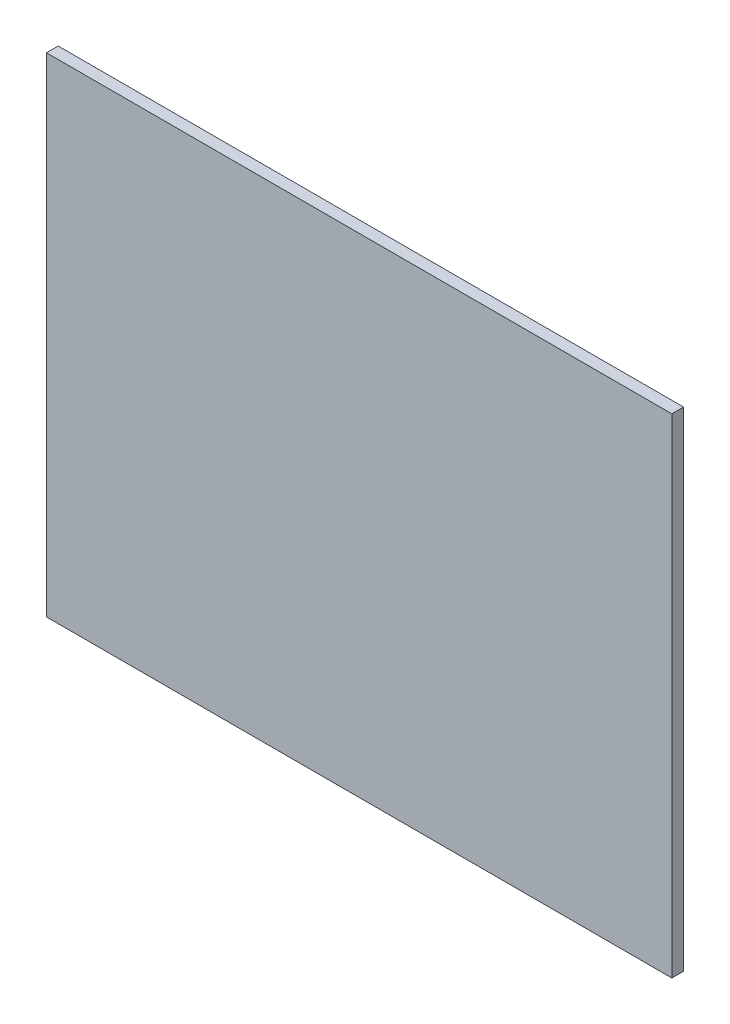
ISO-10303-21;
HEADER;
FILE_DESCRIPTION(('STEP AP214'),'2;1');
FILE_NAME('part.step','',(''),(''),'','','');
FILE_SCHEMA(('AUTOMOTIVE_DESIGN { 1 0 10303 214 1 1 1 1 }'));
ENDSEC;
DATA;
#1=APPLICATION_CONTEXT('core data for automotive mechanical design processes');
#2=APPLICATION_PROTOCOL_DEFINITION('international standard','automotive_design',2000,#1);
#3=PRODUCT_CONTEXT('',#1,'mechanical');
#4=PRODUCT('Part','Part','',(#3));
#5=PRODUCT_RELATED_PRODUCT_CATEGORY('part','',(#4));
#6=PRODUCT_DEFINITION_FORMATION('','',#4);
#7=PRODUCT_DEFINITION_CONTEXT('part definition',#1,'design');
#8=PRODUCT_DEFINITION('design','',#6,#7);
#9=PRODUCT_DEFINITION_SHAPE('','',#8);
#10=(LENGTH_UNIT() NAMED_UNIT(*) SI_UNIT(.MILLI.,.METRE.));
#11=(NAMED_UNIT(*) PLANE_ANGLE_UNIT() SI_UNIT($,.RADIAN.));
#12=(NAMED_UNIT(*) SI_UNIT($,.STERADIAN.) SOLID_ANGLE_UNIT());
#13=UNCERTAINTY_MEASURE_WITH_UNIT(LENGTH_MEASURE(1.E-05),#10,'distance_accuracy_value','');
#14=(GEOMETRIC_REPRESENTATION_CONTEXT(3) GLOBAL_UNCERTAINTY_ASSIGNED_CONTEXT((#13)) GLOBAL_UNIT_ASSIGNED_CONTEXT((#10,
#11,#12)) REPRESENTATION_CONTEXT('',''));
#15=CARTESIAN_POINT('',(0.,0.,0.));
#16=DIRECTION('',(0.,0.,1.));
#17=DIRECTION('',(1.,0.,0.));
#18=AXIS2_PLACEMENT_3D('',#15,#16,#17);
#19=CARTESIAN_POINT('',(0.,0.,0.));
#20=DIRECTION('',(0.,0.,1.));
#21=DIRECTION('',(1.,0.,0.));
#22=AXIS2_PLACEMENT_3D('',#19,#20,#21);
#23=PLANE('',#22);
#24=DIRECTION('',(1.,0.,0.));
#25=VECTOR('',#24,1.);
#26=CARTESIAN_POINT('',(-80.,-62.5,0.));
#27=LINE('',#26,#25);
#28=CARTESIAN_POINT('',(-80.,-62.5,0.));
#29=VERTEX_POINT('',#28);
#30=CARTESIAN_POINT('',(80.,-62.5,0.));
#31=VERTEX_POINT('',#30);
#32=EDGE_CURVE('E27',#29,#31,#27,.T.);
#33=ORIENTED_EDGE('',*,*,#32,.F.);
#34=DIRECTION('',(0.,-1.,0.));
#35=VECTOR('',#34,1.);
#36=CARTESIAN_POINT('',(-80.,62.5,0.));
#37=LINE('',#36,#35);
#38=CARTESIAN_POINT('',(-80.,62.5,0.));
#39=VERTEX_POINT('',#38);
#40=EDGE_CURVE('E90',#39,#29,#37,.T.);
#41=ORIENTED_EDGE('',*,*,#40,.F.);
#42=DIRECTION('',(-1.,0.,0.));
#43=VECTOR('',#42,1.);
#44=CARTESIAN_POINT('',(80.,62.5,0.));
#45=LINE('',#44,#43);
#46=CARTESIAN_POINT('',(80.,62.5,0.));
#47=VERTEX_POINT('',#46);
#48=EDGE_CURVE('E75',#47,#39,#45,.T.);
#49=ORIENTED_EDGE('',*,*,#48,.F.);
#50=DIRECTION('',(0.,1.,0.));
#51=VECTOR('',#50,1.);
#52=CARTESIAN_POINT('',(80.,-62.5,0.));
#53=LINE('',#52,#51);
#54=EDGE_CURVE('E108',#31,#47,#53,.T.);
#55=ORIENTED_EDGE('',*,*,#54,.F.);
#56=EDGE_LOOP('',(#33,#41,#49,#55));
#57=FACE_BOUND('',#56,.T.);
#58=ADVANCED_FACE('F17',(#57),#23,.F.);
#59=CARTESIAN_POINT('',(0.,0.,3.));
#60=DIRECTION('',(0.,0.,1.));
#61=DIRECTION('',(1.,0.,0.));
#62=AXIS2_PLACEMENT_3D('',#59,#60,#61);
#63=PLANE('',#62);
#64=DIRECTION('',(1.,0.,0.));
#65=VECTOR('',#64,1.);
#66=CARTESIAN_POINT('',(-80.,-62.5,3.));
#67=LINE('',#66,#65);
#68=CARTESIAN_POINT('',(-80.,-62.5,3.));
#69=VERTEX_POINT('',#68);
#70=CARTESIAN_POINT('',(80.,-62.5,3.));
#71=VERTEX_POINT('',#70);
#72=EDGE_CURVE('E11',#69,#71,#67,.T.);
#73=ORIENTED_EDGE('',*,*,#72,.T.);
#74=DIRECTION('',(0.,1.,0.));
#75=VECTOR('',#74,1.);
#76=CARTESIAN_POINT('',(80.,-62.5,3.));
#77=LINE('',#76,#75);
#78=CARTESIAN_POINT('',(80.,62.5,3.));
#79=VERTEX_POINT('',#78);
#80=EDGE_CURVE('E106',#71,#79,#77,.T.);
#81=ORIENTED_EDGE('',*,*,#80,.T.);
#82=DIRECTION('',(-1.,0.,0.));
#83=VECTOR('',#82,1.);
#84=CARTESIAN_POINT('',(80.,62.5,3.));
#85=LINE('',#84,#83);
#86=CARTESIAN_POINT('',(-80.,62.5,3.));
#87=VERTEX_POINT('',#86);
#88=EDGE_CURVE('E83',#79,#87,#85,.T.);
#89=ORIENTED_EDGE('',*,*,#88,.T.);
#90=DIRECTION('',(0.,-1.,0.));
#91=VECTOR('',#90,1.);
#92=CARTESIAN_POINT('',(-80.,62.5,3.));
#93=LINE('',#92,#91);
#94=EDGE_CURVE('E89',#87,#69,#93,.T.);
#95=ORIENTED_EDGE('',*,*,#94,.T.);
#96=EDGE_LOOP('',(#73,#81,#89,#95));
#97=FACE_BOUND('',#96,.T.);
#98=ADVANCED_FACE('F159',(#97),#63,.T.);
#99=CARTESIAN_POINT('',(-80.,-62.5,0.));
#100=DIRECTION('',(0.,-1.,0.));
#101=DIRECTION('',(0.,0.,-1.));
#102=AXIS2_PLACEMENT_3D('',#99,#100,#101);
#103=PLANE('',#102);
#104=ORIENTED_EDGE('',*,*,#32,.T.);
#105=DIRECTION('',(0.,0.,1.));
#106=VECTOR('',#105,1.);
#107=CARTESIAN_POINT('',(80.,-62.5,0.));
#108=LINE('',#107,#106);
#109=EDGE_CURVE('E102',#31,#71,#108,.T.);
#110=ORIENTED_EDGE('',*,*,#109,.T.);
#111=ORIENTED_EDGE('',*,*,#72,.F.);
#112=DIRECTION('',(0.,0.,1.));
#113=VECTOR('',#112,1.);
#114=CARTESIAN_POINT('',(-80.,-62.5,0.));
#115=LINE('',#114,#113);
#116=EDGE_CURVE('E94',#29,#69,#115,.T.);
#117=ORIENTED_EDGE('',*,*,#116,.F.);
#118=EDGE_LOOP('',(#104,#110,#111,#117));
#119=FACE_BOUND('',#118,.T.);
#120=ADVANCED_FACE('F19',(#119),#103,.T.);
#121=CARTESIAN_POINT('',(80.,-62.5,0.));
#122=DIRECTION('',(1.,0.,0.));
#123=DIRECTION('',(0.,1.,0.));
#124=AXIS2_PLACEMENT_3D('',#121,#122,#123);
#125=PLANE('',#124);
#126=ORIENTED_EDGE('',*,*,#54,.T.);
#127=DIRECTION('',(0.,0.,1.));
#128=VECTOR('',#127,1.);
#129=CARTESIAN_POINT('',(80.,62.5,0.));
#130=LINE('',#129,#128);
#131=EDGE_CURVE('E77',#47,#79,#130,.T.);
#132=ORIENTED_EDGE('',*,*,#131,.T.);
#133=ORIENTED_EDGE('',*,*,#80,.F.);
#134=ORIENTED_EDGE('',*,*,#109,.F.);
#135=EDGE_LOOP('',(#126,#132,#133,#134));
#136=FACE_BOUND('',#135,.T.);
#137=ADVANCED_FACE('F157',(#136),#125,.T.);
#138=CARTESIAN_POINT('',(80.,62.5,0.));
#139=DIRECTION('',(0.,1.,0.));
#140=DIRECTION('',(1.,0.,0.));
#141=AXIS2_PLACEMENT_3D('',#138,#139,#140);
#142=PLANE('',#141);
#143=ORIENTED_EDGE('',*,*,#48,.T.);
#144=DIRECTION('',(0.,0.,1.));
#145=VECTOR('',#144,1.);
#146=CARTESIAN_POINT('',(-80.,62.5,0.));
#147=LINE('',#146,#145);
#148=EDGE_CURVE('E74',#39,#87,#147,.T.);
#149=ORIENTED_EDGE('',*,*,#148,.T.);
#150=ORIENTED_EDGE('',*,*,#88,.F.);
#151=ORIENTED_EDGE('',*,*,#131,.F.);
#152=EDGE_LOOP('',(#143,#149,#150,#151));
#153=FACE_BOUND('',#152,.T.);
#154=ADVANCED_FACE('F73',(#153),#142,.T.);
#155=CARTESIAN_POINT('',(-80.,62.5,0.));
#156=DIRECTION('',(-1.,0.,0.));
#157=DIRECTION('',(0.,0.,1.));
#158=AXIS2_PLACEMENT_3D('',#155,#156,#157);
#159=PLANE('',#158);
#160=ORIENTED_EDGE('',*,*,#40,.T.);
#161=ORIENTED_EDGE('',*,*,#116,.T.);
#162=ORIENTED_EDGE('',*,*,#94,.F.);
#163=ORIENTED_EDGE('',*,*,#148,.F.);
#164=EDGE_LOOP('',(#160,#161,#162,#163));
#165=FACE_BOUND('',#164,.T.);
#166=ADVANCED_FACE('F87',(#165),#159,.T.);
#167=CLOSED_SHELL('',(#58,#98,#120,#137,#154,#166));
#168=MANIFOLD_SOLID_BREP('B1',#167);
#169=ADVANCED_BREP_SHAPE_REPRESENTATION('',(#18,#168),#14);
#170=SHAPE_DEFINITION_REPRESENTATION(#9,#169);
ENDSEC;
END-ISO-10303-21;
